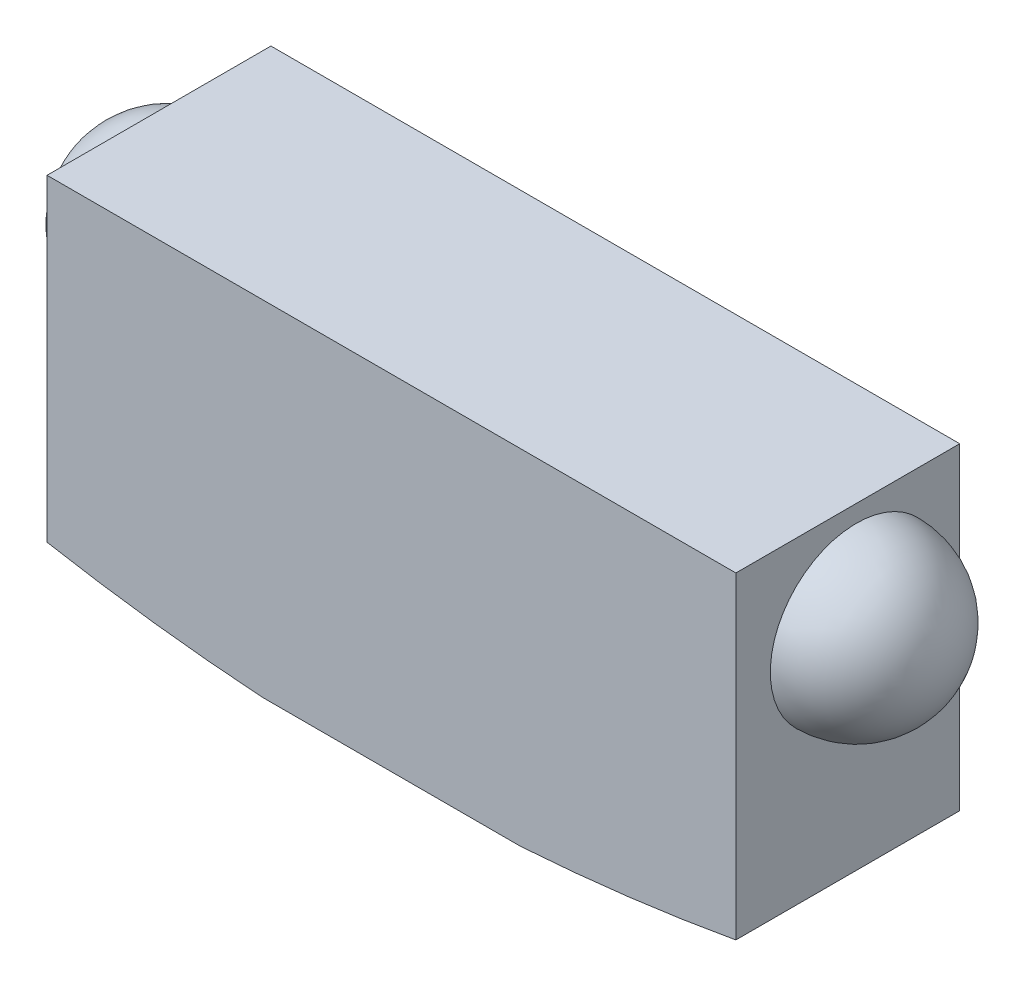
ISO-10303-21;
HEADER;
FILE_DESCRIPTION(('STEP AP214'),'2;1');
FILE_NAME('part.step','',(''),(''),'','','');
FILE_SCHEMA(('AUTOMOTIVE_DESIGN { 1 0 10303 214 1 1 1 1 }'));
ENDSEC;
DATA;
#1=APPLICATION_CONTEXT('core data for automotive mechanical design processes');
#2=APPLICATION_PROTOCOL_DEFINITION('international standard','automotive_design',2000,#1);
#3=PRODUCT_CONTEXT('',#1,'mechanical');
#4=PRODUCT('Part','Part','',(#3));
#5=PRODUCT_RELATED_PRODUCT_CATEGORY('part','',(#4));
#6=PRODUCT_DEFINITION_FORMATION('','',#4);
#7=PRODUCT_DEFINITION_CONTEXT('part definition',#1,'design');
#8=PRODUCT_DEFINITION('design','',#6,#7);
#9=PRODUCT_DEFINITION_SHAPE('','',#8);
#10=(LENGTH_UNIT() NAMED_UNIT(*) SI_UNIT(.MILLI.,.METRE.));
#11=(NAMED_UNIT(*) PLANE_ANGLE_UNIT() SI_UNIT($,.RADIAN.));
#12=(NAMED_UNIT(*) SI_UNIT($,.STERADIAN.) SOLID_ANGLE_UNIT());
#13=UNCERTAINTY_MEASURE_WITH_UNIT(LENGTH_MEASURE(1.E-05),#10,'distance_accuracy_value','');
#14=(GEOMETRIC_REPRESENTATION_CONTEXT(3) GLOBAL_UNCERTAINTY_ASSIGNED_CONTEXT((#13)) GLOBAL_UNIT_ASSIGNED_CONTEXT((#10,
#11,#12)) REPRESENTATION_CONTEXT('',''));
#15=CARTESIAN_POINT('',(0.,0.,0.));
#16=DIRECTION('',(0.,0.,1.));
#17=DIRECTION('',(1.,0.,0.));
#18=AXIS2_PLACEMENT_3D('',#15,#16,#17);
#19=CARTESIAN_POINT('',(100.,-50.,65.));
#20=DIRECTION('',(1.,0.,0.));
#21=DIRECTION('',(0.,0.,-1.));
#22=AXIS2_PLACEMENT_3D('',#19,#20,#21);
#23=PLANE('',#22);
#24=DIRECTION('',(0.,1.,0.));
#25=VECTOR('',#24,1.);
#26=CARTESIAN_POINT('',(100.,-50.,0.));
#27=LINE('',#26,#25);
#28=CARTESIAN_POINT('',(100.,-42.2858578233202,0.));
#29=VERTEX_POINT('',#28);
#30=CARTESIAN_POINT('',(100.,50.,0.));
#31=VERTEX_POINT('',#30);
#32=EDGE_CURVE('E89',#29,#31,#27,.T.);
#33=ORIENTED_EDGE('',*,*,#32,.F.);
#34=DIRECTION('',(0.,0.,-1.));
#35=VECTOR('',#34,1.);
#36=CARTESIAN_POINT('',(100.,-42.2858578233202,77.));
#37=LINE('',#36,#35);
#38=CARTESIAN_POINT('',(100.,-42.2858578233202,-65.));
#39=VERTEX_POINT('',#38);
#40=EDGE_CURVE('E138',#29,#39,#37,.T.);
#41=ORIENTED_EDGE('',*,*,#40,.T.);
#42=DIRECTION('',(0.,1.,0.));
#43=VECTOR('',#42,1.);
#44=CARTESIAN_POINT('',(100.,-50.,-65.));
#45=LINE('',#44,#43);
#46=CARTESIAN_POINT('',(100.,50.,-65.));
#47=VERTEX_POINT('',#46);
#48=EDGE_CURVE('E110',#39,#47,#45,.T.);
#49=ORIENTED_EDGE('',*,*,#48,.T.);
#50=DIRECTION('',(0.,0.,-1.));
#51=VECTOR('',#50,1.);
#52=CARTESIAN_POINT('',(100.,50.,65.));
#53=LINE('',#52,#51);
#54=EDGE_CURVE('E112',#31,#47,#53,.T.);
#55=ORIENTED_EDGE('',*,*,#54,.F.);
#56=EDGE_LOOP('',(#33,#41,#49,#55));
#57=FACE_BOUND('',#56,.T.);
#58=CARTESIAN_POINT('',(100.,20.,-35.));
#59=DIRECTION('',(1.,0.,0.));
#60=DIRECTION('',(0.,0.,-1.));
#61=AXIS2_PLACEMENT_3D('',#58,#59,#60);
#62=CIRCLE('',#61,25.);
#63=CARTESIAN_POINT('',(100.,20.,-60.));
#64=VERTEX_POINT('',#63);
#65=EDGE_CURVE('E123',#64,#64,#62,.T.);
#66=ORIENTED_EDGE('',*,*,#65,.F.);
#67=EDGE_LOOP('',(#66));
#68=FACE_BOUND('',#67,.T.);
#69=ADVANCED_FACE('F33',(#57,#68),#23,.T.);
#70=CARTESIAN_POINT('',(-100.,-50.,65.));
#71=DIRECTION('',(-1.,0.,0.));
#72=DIRECTION('',(0.,0.,1.));
#73=AXIS2_PLACEMENT_3D('',#70,#71,#72);
#74=PLANE('',#73);
#75=DIRECTION('',(0.,1.,0.));
#76=VECTOR('',#75,1.);
#77=CARTESIAN_POINT('',(-100.,-92.,0.));
#78=LINE('',#77,#76);
#79=CARTESIAN_POINT('',(-100.,-42.2858578233202,0.));
#80=VERTEX_POINT('',#79);
#81=CARTESIAN_POINT('',(-100.,50.,0.));
#82=VERTEX_POINT('',#81);
#83=EDGE_CURVE('E86',#80,#82,#78,.T.);
#84=ORIENTED_EDGE('',*,*,#83,.T.);
#85=DIRECTION('',(0.,0.,1.));
#86=VECTOR('',#85,1.);
#87=CARTESIAN_POINT('',(-100.,50.,65.));
#88=LINE('',#87,#86);
#89=CARTESIAN_POINT('',(-100.,50.,-65.));
#90=VERTEX_POINT('',#89);
#91=EDGE_CURVE('E100',#90,#82,#88,.T.);
#92=ORIENTED_EDGE('',*,*,#91,.F.);
#93=DIRECTION('',(0.,1.,0.));
#94=VECTOR('',#93,1.);
#95=CARTESIAN_POINT('',(-100.,-50.,-65.));
#96=LINE('',#95,#94);
#97=CARTESIAN_POINT('',(-100.,-42.2858578233202,-65.));
#98=VERTEX_POINT('',#97);
#99=EDGE_CURVE('E116',#98,#90,#96,.T.);
#100=ORIENTED_EDGE('',*,*,#99,.F.);
#101=DIRECTION('',(0.,0.,-1.));
#102=VECTOR('',#101,1.);
#103=CARTESIAN_POINT('',(-100.,-42.2858578233202,77.));
#104=LINE('',#103,#102);
#105=EDGE_CURVE('E101',#80,#98,#104,.T.);
#106=ORIENTED_EDGE('',*,*,#105,.F.);
#107=EDGE_LOOP('',(#84,#92,#100,#106));
#108=FACE_BOUND('',#107,.T.);
#109=CARTESIAN_POINT('',(-100.,20.,-35.));
#110=DIRECTION('',(-1.,0.,0.));
#111=DIRECTION('',(0.,0.,1.));
#112=AXIS2_PLACEMENT_3D('',#109,#110,#111);
#113=CIRCLE('',#112,25.);
#114=CARTESIAN_POINT('',(-100.,20.,-10.));
#115=VERTEX_POINT('',#114);
#116=EDGE_CURVE('E118',#115,#115,#113,.T.);
#117=ORIENTED_EDGE('',*,*,#116,.F.);
#118=EDGE_LOOP('',(#117));
#119=FACE_BOUND('',#118,.T.);
#120=ADVANCED_FACE('F97',(#108,#119),#74,.T.);
#121=CARTESIAN_POINT('',(-100.,-50.,-65.));
#122=DIRECTION('',(0.,0.,-1.));
#123=DIRECTION('',(-1.,0.,0.));
#124=AXIS2_PLACEMENT_3D('',#121,#122,#123);
#125=PLANE('',#124);
#126=ORIENTED_EDGE('',*,*,#48,.F.);
#127=CARTESIAN_POINT('',(0.,510.775960900919,-65.));
#128=DIRECTION('',(0.,0.,-1.));
#129=DIRECTION('',(-1.,0.,0.));
#130=AXIS2_PLACEMENT_3D('',#127,#128,#129);
#131=CIRCLE('',#130,562.029692570209);
#132=CARTESIAN_POINT('',(37.5192884555948,-50.,-65.));
#133=VERTEX_POINT('',#132);
#134=EDGE_CURVE('E133',#39,#133,#131,.T.);
#135=ORIENTED_EDGE('',*,*,#134,.T.);
#136=DIRECTION('',(-1.,0.,0.));
#137=VECTOR('',#136,1.);
#138=CARTESIAN_POINT('',(-100.,-50.,-65.));
#139=LINE('',#138,#137);
#140=CARTESIAN_POINT('',(-37.5192884555948,-50.,-65.));
#141=VERTEX_POINT('',#140);
#142=EDGE_CURVE('E107',#133,#141,#139,.T.);
#143=ORIENTED_EDGE('',*,*,#142,.T.);
#144=CARTESIAN_POINT('',(0.,510.775960900919,-65.));
#145=DIRECTION('',(0.,0.,-1.));
#146=DIRECTION('',(-1.,0.,0.));
#147=AXIS2_PLACEMENT_3D('',#144,#145,#146);
#148=CIRCLE('',#147,562.029692570209);
#149=EDGE_CURVE('E141',#141,#98,#148,.T.);
#150=ORIENTED_EDGE('',*,*,#149,.T.);
#151=ORIENTED_EDGE('',*,*,#99,.T.);
#152=DIRECTION('',(-1.,0.,0.));
#153=VECTOR('',#152,1.);
#154=CARTESIAN_POINT('',(-100.,50.,-65.));
#155=LINE('',#154,#153);
#156=EDGE_CURVE('E106',#47,#90,#155,.T.);
#157=ORIENTED_EDGE('',*,*,#156,.F.);
#158=EDGE_LOOP('',(#126,#135,#143,#150,#151,#157));
#159=FACE_BOUND('',#158,.T.);
#160=ADVANCED_FACE('F136',(#159),#125,.T.);
#161=CARTESIAN_POINT('',(0.,-50.,0.));
#162=DIRECTION('',(0.,-1.,0.));
#163=DIRECTION('',(0.,0.,-1.));
#164=AXIS2_PLACEMENT_3D('',#161,#162,#163);
#165=PLANE('',#164);
#166=DIRECTION('',(1.,0.,0.));
#167=VECTOR('',#166,1.);
#168=CARTESIAN_POINT('',(0.,-50.,0.));
#169=LINE('',#168,#167);
#170=CARTESIAN_POINT('',(-37.5192884555948,-50.,0.));
#171=VERTEX_POINT('',#170);
#172=CARTESIAN_POINT('',(37.5192884555948,-50.,0.));
#173=VERTEX_POINT('',#172);
#174=EDGE_CURVE('E46',#171,#173,#169,.T.);
#175=ORIENTED_EDGE('',*,*,#174,.F.);
#176=DIRECTION('',(0.,0.,-1.));
#177=VECTOR('',#176,1.);
#178=CARTESIAN_POINT('',(-37.5192884555948,-50.,77.));
#179=LINE('',#178,#177);
#180=EDGE_CURVE('E53',#171,#141,#179,.T.);
#181=ORIENTED_EDGE('',*,*,#180,.T.);
#182=ORIENTED_EDGE('',*,*,#142,.F.);
#183=DIRECTION('',(0.,0.,-1.));
#184=VECTOR('',#183,1.);
#185=CARTESIAN_POINT('',(37.5192884555948,-50.,77.));
#186=LINE('',#185,#184);
#187=EDGE_CURVE('E40',#133,#173,#186,.F.);
#188=ORIENTED_EDGE('',*,*,#187,.T.);
#189=EDGE_LOOP('',(#175,#181,#182,#188));
#190=FACE_BOUND('',#189,.T.);
#191=ADVANCED_FACE('F127',(#190),#165,.T.);
#192=CARTESIAN_POINT('',(0.,50.,0.));
#193=DIRECTION('',(0.,-1.,0.));
#194=DIRECTION('',(0.,0.,-1.));
#195=AXIS2_PLACEMENT_3D('',#192,#193,#194);
#196=PLANE('',#195);
#197=ORIENTED_EDGE('',*,*,#91,.T.);
#198=DIRECTION('',(-1.,0.,0.));
#199=VECTOR('',#198,1.);
#200=CARTESIAN_POINT('',(-100.,50.,0.));
#201=LINE('',#200,#199);
#202=EDGE_CURVE('E83',#31,#82,#201,.T.);
#203=ORIENTED_EDGE('',*,*,#202,.F.);
#204=ORIENTED_EDGE('',*,*,#54,.T.);
#205=ORIENTED_EDGE('',*,*,#156,.T.);
#206=EDGE_LOOP('',(#197,#203,#204,#205));
#207=FACE_BOUND('',#206,.T.);
#208=ADVANCED_FACE('F104',(#207),#196,.F.);
#209=CARTESIAN_POINT('',(-100.,20.,-35.));
#210=DIRECTION('',(0.,-1.,0.));
#211=DIRECTION('',(0.,0.,-1.));
#212=AXIS2_PLACEMENT_3D('',#209,#210,#211);
#213=SPHERICAL_SURFACE('',#212,25.);
#214=CARTESIAN_POINT('',(-100.,20.,-35.));
#215=DIRECTION('',(-1.,0.,0.));
#216=DIRECTION('',(0.,0.,1.));
#217=AXIS2_PLACEMENT_3D('',#214,#215,#216);
#218=SPHERICAL_SURFACE('',#217,25.);
#219=ORIENTED_EDGE('',*,*,#116,.T.);
#220=EDGE_LOOP('',(#219));
#221=FACE_BOUND('',#220,.T.);
#222=ADVANCED_FACE('F161',(#221),#218,.T.);
#223=CARTESIAN_POINT('',(100.,20.,-35.));
#224=DIRECTION('',(0.,-1.,0.));
#225=DIRECTION('',(0.,0.,-1.));
#226=AXIS2_PLACEMENT_3D('',#223,#224,#225);
#227=SPHERICAL_SURFACE('',#226,25.);
#228=CARTESIAN_POINT('',(100.,20.,-35.));
#229=DIRECTION('',(1.,0.,0.));
#230=DIRECTION('',(0.,0.,-1.));
#231=AXIS2_PLACEMENT_3D('',#228,#229,#230);
#232=SPHERICAL_SURFACE('',#231,25.);
#233=ORIENTED_EDGE('',*,*,#65,.T.);
#234=EDGE_LOOP('',(#233));
#235=FACE_BOUND('',#234,.T.);
#236=ADVANCED_FACE('F153',(#235),#232,.T.);
#237=CARTESIAN_POINT('',(0.,510.775960900919,77.));
#238=DIRECTION('',(0.,0.,-1.));
#239=DIRECTION('',(-1.,0.,0.));
#240=AXIS2_PLACEMENT_3D('',#237,#238,#239);
#241=CYLINDRICAL_SURFACE('',#240,562.029692570209);
#242=CARTESIAN_POINT('',(0.,510.775960900919,0.));
#243=DIRECTION('',(0.,0.,-1.));
#244=DIRECTION('',(-1.,0.,0.));
#245=AXIS2_PLACEMENT_3D('',#242,#243,#244);
#246=CIRCLE('',#245,562.029692570209);
#247=EDGE_CURVE('E144',#80,#171,#246,.F.);
#248=ORIENTED_EDGE('',*,*,#247,.F.);
#249=ORIENTED_EDGE('',*,*,#105,.T.);
#250=ORIENTED_EDGE('',*,*,#149,.F.);
#251=ORIENTED_EDGE('',*,*,#180,.F.);
#252=EDGE_LOOP('',(#248,#249,#250,#251));
#253=FACE_BOUND('',#252,.T.);
#254=ADVANCED_FACE('F150',(#253),#241,.T.);
#255=CARTESIAN_POINT('',(0.,510.775960900919,77.));
#256=DIRECTION('',(0.,0.,-1.));
#257=DIRECTION('',(-1.,0.,0.));
#258=AXIS2_PLACEMENT_3D('',#255,#256,#257);
#259=CYLINDRICAL_SURFACE('',#258,562.029692570209);
#260=CARTESIAN_POINT('',(0.,510.775960900919,0.));
#261=DIRECTION('',(0.,0.,-1.));
#262=DIRECTION('',(-1.,0.,0.));
#263=AXIS2_PLACEMENT_3D('',#260,#261,#262);
#264=CIRCLE('',#263,562.029692570209);
#265=EDGE_CURVE('E11',#173,#29,#264,.F.);
#266=ORIENTED_EDGE('',*,*,#265,.F.);
#267=ORIENTED_EDGE('',*,*,#187,.F.);
#268=ORIENTED_EDGE('',*,*,#134,.F.);
#269=ORIENTED_EDGE('',*,*,#40,.F.);
#270=EDGE_LOOP('',(#266,#267,#268,#269));
#271=FACE_BOUND('',#270,.T.);
#272=ADVANCED_FACE('F131',(#271),#259,.T.);
#273=CARTESIAN_POINT('',(-100.,-92.,0.));
#274=DIRECTION('',(0.,0.,-1.));
#275=DIRECTION('',(-1.,0.,0.));
#276=AXIS2_PLACEMENT_3D('',#273,#274,#275);
#277=PLANE('',#276);
#278=ORIENTED_EDGE('',*,*,#247,.T.);
#279=ORIENTED_EDGE('',*,*,#174,.T.);
#280=ORIENTED_EDGE('',*,*,#265,.T.);
#281=ORIENTED_EDGE('',*,*,#32,.T.);
#282=ORIENTED_EDGE('',*,*,#202,.T.);
#283=ORIENTED_EDGE('',*,*,#83,.F.);
#284=EDGE_LOOP('',(#278,#279,#280,#281,#282,#283));
#285=FACE_BOUND('',#284,.T.);
#286=ADVANCED_FACE('F85',(#285),#277,.F.);
#287=CLOSED_SHELL('',(#69,#120,#160,#191,#208,#222,#236,#254,#272,#286));
#288=MANIFOLD_SOLID_BREP('B2',#287);
#289=ADVANCED_BREP_SHAPE_REPRESENTATION('',(#18,#288),#14);
#290=SHAPE_DEFINITION_REPRESENTATION(#9,#289);
ENDSEC;
END-ISO-10303-21;
